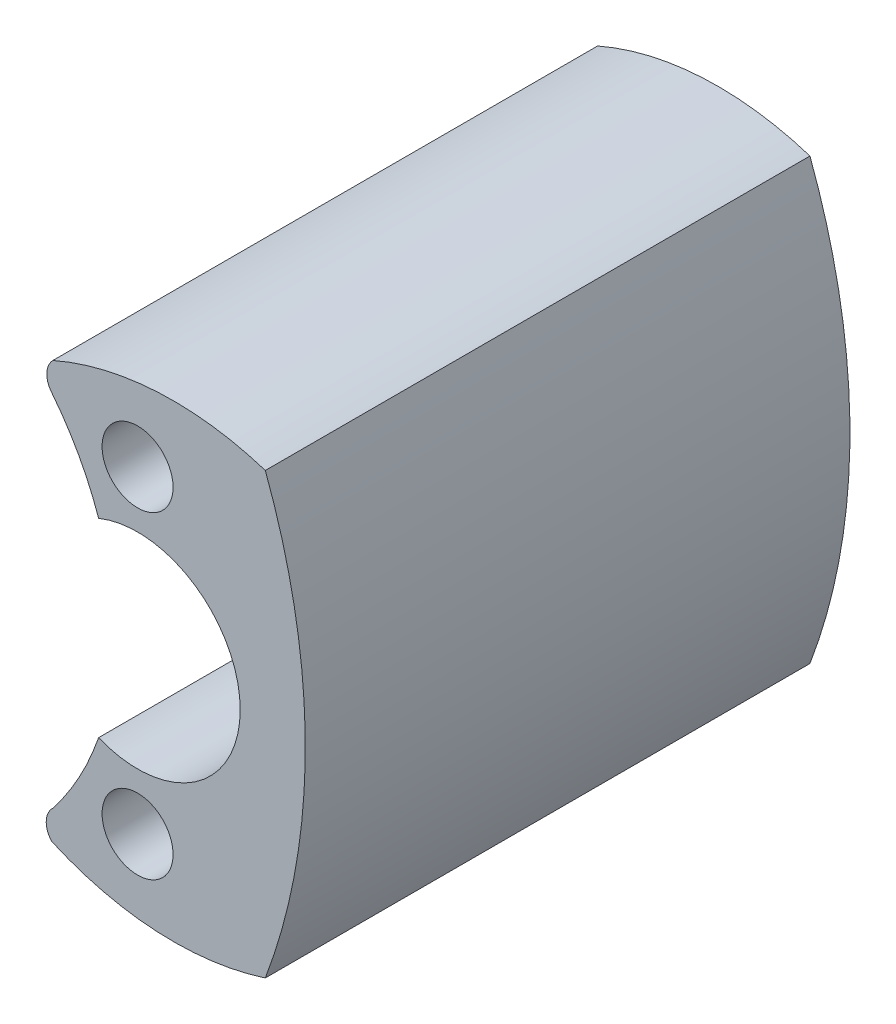
ISO-10303-21;
HEADER;
FILE_DESCRIPTION(('STEP AP214'),'2;1');
FILE_NAME('part.step','',(''),(''),'','','');
FILE_SCHEMA(('AUTOMOTIVE_DESIGN { 1 0 10303 214 1 1 1 1 }'));
ENDSEC;
DATA;
#1=APPLICATION_CONTEXT('core data for automotive mechanical design processes');
#2=APPLICATION_PROTOCOL_DEFINITION('international standard','automotive_design',2000,#1);
#3=PRODUCT_CONTEXT('',#1,'mechanical');
#4=PRODUCT('Part','Part','',(#3));
#5=PRODUCT_RELATED_PRODUCT_CATEGORY('part','',(#4));
#6=PRODUCT_DEFINITION_FORMATION('','',#4);
#7=PRODUCT_DEFINITION_CONTEXT('part definition',#1,'design');
#8=PRODUCT_DEFINITION('design','',#6,#7);
#9=PRODUCT_DEFINITION_SHAPE('','',#8);
#10=(LENGTH_UNIT() NAMED_UNIT(*) SI_UNIT(.MILLI.,.METRE.));
#11=(NAMED_UNIT(*) PLANE_ANGLE_UNIT() SI_UNIT($,.RADIAN.));
#12=(NAMED_UNIT(*) SI_UNIT($,.STERADIAN.) SOLID_ANGLE_UNIT());
#13=UNCERTAINTY_MEASURE_WITH_UNIT(LENGTH_MEASURE(1.E-05),#10,'distance_accuracy_value','');
#14=(GEOMETRIC_REPRESENTATION_CONTEXT(3) GLOBAL_UNCERTAINTY_ASSIGNED_CONTEXT((#13)) GLOBAL_UNIT_ASSIGNED_CONTEXT((#10,
#11,#12)) REPRESENTATION_CONTEXT('',''));
#15=CARTESIAN_POINT('',(0.,0.,0.));
#16=DIRECTION('',(0.,0.,1.));
#17=DIRECTION('',(1.,0.,0.));
#18=AXIS2_PLACEMENT_3D('',#15,#16,#17);
#19=CARTESIAN_POINT('',(-13.2313355478784,0.,23.));
#20=DIRECTION('',(0.,0.,-1.));
#21=DIRECTION('',(-1.,0.,0.));
#22=AXIS2_PLACEMENT_3D('',#19,#20,#21);
#23=CYLINDRICAL_SURFACE('',#22,12.2604861513936);
#24=CARTESIAN_POINT('',(-13.2313355478784,0.,23.));
#25=DIRECTION('',(0.,0.,-1.));
#26=DIRECTION('',(-1.,0.,0.));
#27=AXIS2_PLACEMENT_3D('',#24,#25,#26);
#28=CIRCLE('',#27,12.2604861513936);
#29=CARTESIAN_POINT('',(-1.64537225114125,-4.01060782864323,23.));
#30=VERTEX_POINT('',#29);
#31=CARTESIAN_POINT('',(-3.57576767996249,-7.55576136577806,23.));
#32=VERTEX_POINT('',#31);
#33=EDGE_CURVE('E123',#30,#32,#28,.T.);
#34=ORIENTED_EDGE('',*,*,#33,.F.);
#35=DIRECTION('',(0.,0.,-1.));
#36=VECTOR('',#35,1.);
#37=CARTESIAN_POINT('',(-1.64537225114125,-4.01060782864323,11.999));
#38=LINE('',#37,#36);
#39=CARTESIAN_POINT('',(-1.64537225114125,-4.01060782864323,-0.001));
#40=VERTEX_POINT('',#39);
#41=EDGE_CURVE('E110',#30,#40,#38,.T.);
#42=ORIENTED_EDGE('',*,*,#41,.T.);
#43=CARTESIAN_POINT('',(-13.2313355478784,0.,-0.001));
#44=DIRECTION('',(0.,0.,-1.));
#45=DIRECTION('',(-1.,0.,0.));
#46=AXIS2_PLACEMENT_3D('',#43,#44,#45);
#47=CIRCLE('',#46,12.2604861513936);
#48=CARTESIAN_POINT('',(-3.57576767996249,-7.55576136577806,-0.001));
#49=VERTEX_POINT('',#48);
#50=EDGE_CURVE('E121',#40,#49,#47,.T.);
#51=ORIENTED_EDGE('',*,*,#50,.T.);
#52=DIRECTION('',(0.,0.,-1.));
#53=VECTOR('',#52,1.);
#54=CARTESIAN_POINT('',(-3.57576767996249,-7.55576136577806,23.));
#55=LINE('',#54,#53);
#56=EDGE_CURVE('E165',#32,#49,#55,.T.);
#57=ORIENTED_EDGE('',*,*,#56,.F.);
#58=EDGE_LOOP('',(#34,#42,#51,#57));
#59=FACE_BOUND('',#58,.T.);
#60=ADVANCED_FACE('F45',(#59),#23,.F.);
#61=CARTESIAN_POINT('',(1.51645658150854,-2.74018411875687,23.));
#62=DIRECTION('',(0.,0.,-1.));
#63=DIRECTION('',(-1.,0.,0.));
#64=AXIS2_PLACEMENT_3D('',#61,#62,#63);
#65=CYLINDRICAL_SURFACE('',#64,12.6318125052895);
#66=DIRECTION('',(0.,0.,-1.));
#67=VECTOR('',#66,1.);
#68=CARTESIAN_POINT('',(5.39429470920508,9.28167341758802,23.));
#69=LINE('',#68,#67);
#70=CARTESIAN_POINT('',(5.39429470920508,9.28167341758802,23.));
#71=VERTEX_POINT('',#70);
#72=CARTESIAN_POINT('',(5.39429470920508,9.28167341758802,-0.001));
#73=VERTEX_POINT('',#72);
#74=EDGE_CURVE('E159',#71,#73,#69,.T.);
#75=ORIENTED_EDGE('',*,*,#74,.T.);
#76=CARTESIAN_POINT('',(1.51645658150854,-2.74018411875687,-0.001));
#77=DIRECTION('',(0.,0.,1.));
#78=DIRECTION('',(-1.,0.,0.));
#79=AXIS2_PLACEMENT_3D('',#76,#77,#78);
#80=CIRCLE('',#79,12.6318125052895);
#81=CARTESIAN_POINT('',(-3.57576767996249,8.81974404882597,-0.001));
#82=VERTEX_POINT('',#81);
#83=EDGE_CURVE('E136',#73,#82,#80,.T.);
#84=ORIENTED_EDGE('',*,*,#83,.T.);
#85=DIRECTION('',(0.,0.,-1.));
#86=VECTOR('',#85,1.);
#87=CARTESIAN_POINT('',(-3.57576767996249,8.81974404882597,23.));
#88=LINE('',#87,#86);
#89=CARTESIAN_POINT('',(-3.57576767996249,8.81974404882597,23.));
#90=VERTEX_POINT('',#89);
#91=EDGE_CURVE('E11',#90,#82,#88,.T.);
#92=ORIENTED_EDGE('',*,*,#91,.F.);
#93=CARTESIAN_POINT('',(1.51645658150854,-2.74018411875687,23.));
#94=DIRECTION('',(0.,0.,1.));
#95=DIRECTION('',(-1.,0.,0.));
#96=AXIS2_PLACEMENT_3D('',#93,#94,#95);
#97=CIRCLE('',#96,12.6318125052895);
#98=EDGE_CURVE('E147',#71,#90,#97,.T.);
#99=ORIENTED_EDGE('',*,*,#98,.F.);
#100=EDGE_LOOP('',(#75,#84,#92,#99));
#101=FACE_BOUND('',#100,.T.);
#102=ADVANCED_FACE('F47',(#101),#65,.T.);
#103=CARTESIAN_POINT('',(-2.93942531431104,8.19213389498871,23.));
#104=DIRECTION('',(0.,0.,-1.));
#105=DIRECTION('',(-1.,0.,0.));
#106=AXIS2_PLACEMENT_3D('',#103,#104,#105);
#107=CYLINDRICAL_SURFACE('',#106,0.893770726485547);
#108=ORIENTED_EDGE('',*,*,#91,.T.);
#109=CARTESIAN_POINT('',(-2.93942531431104,8.19213389498871,-0.001));
#110=DIRECTION('',(0.,0.,1.));
#111=DIRECTION('',(-1.,0.,0.));
#112=AXIS2_PLACEMENT_3D('',#109,#110,#111);
#113=CIRCLE('',#112,0.893770726485547);
#114=CARTESIAN_POINT('',(-3.63871286599695,7.63551640372596,-0.001));
#115=VERTEX_POINT('',#114);
#116=EDGE_CURVE('E133',#82,#115,#113,.T.);
#117=ORIENTED_EDGE('',*,*,#116,.T.);
#118=DIRECTION('',(0.,0.,-1.));
#119=VECTOR('',#118,1.);
#120=CARTESIAN_POINT('',(-3.63871286599695,7.63551640372596,23.));
#121=LINE('',#120,#119);
#122=CARTESIAN_POINT('',(-3.63871286599695,7.63551640372596,23.));
#123=VERTEX_POINT('',#122);
#124=EDGE_CURVE('E53',#123,#115,#121,.T.);
#125=ORIENTED_EDGE('',*,*,#124,.F.);
#126=CARTESIAN_POINT('',(-2.93942531431104,8.19213389498871,23.));
#127=DIRECTION('',(0.,0.,1.));
#128=DIRECTION('',(-1.,0.,0.));
#129=AXIS2_PLACEMENT_3D('',#126,#127,#128);
#130=CIRCLE('',#129,0.893770726485547);
#131=EDGE_CURVE('E149',#90,#123,#130,.T.);
#132=ORIENTED_EDGE('',*,*,#131,.F.);
#133=EDGE_LOOP('',(#108,#117,#125,#132));
#134=FACE_BOUND('',#133,.T.);
#135=ADVANCED_FACE('F174',(#134),#107,.T.);
#136=CARTESIAN_POINT('',(-1.64537225114125,4.01060782864323,-0.00100000000000088));
#137=VERTEX_POINT('',#136);
#138=EDGE_CURVE('E132',#115,#137,#47,.T.);
#139=ORIENTED_EDGE('',*,*,#138,.T.);
#140=DIRECTION('',(0.,0.,-1.));
#141=VECTOR('',#140,1.);
#142=CARTESIAN_POINT('',(-1.64537225114125,4.01060782864323,11.999));
#143=LINE('',#142,#141);
#144=CARTESIAN_POINT('',(-1.64537225114125,4.01060782864323,23.));
#145=VERTEX_POINT('',#144);
#146=EDGE_CURVE('E60',#137,#145,#143,.F.);
#147=ORIENTED_EDGE('',*,*,#146,.T.);
#148=EDGE_CURVE('E151',#123,#145,#28,.T.);
#149=ORIENTED_EDGE('',*,*,#148,.F.);
#150=ORIENTED_EDGE('',*,*,#124,.T.);
#151=EDGE_LOOP('',(#139,#147,#149,#150));
#152=FACE_BOUND('',#151,.T.);
#153=ADVANCED_FACE('F169',(#152),#23,.F.);
#154=CARTESIAN_POINT('',(-2.97974763085371,-8.20163469798779,23.));
#155=DIRECTION('',(0.,0.,-1.));
#156=DIRECTION('',(-1.,0.,0.));
#157=AXIS2_PLACEMENT_3D('',#154,#155,#156);
#158=CYLINDRICAL_SURFACE('',#157,0.878858498393984);
#159=ORIENTED_EDGE('',*,*,#56,.T.);
#160=CARTESIAN_POINT('',(-2.97974763085371,-8.20163469798779,-0.001));
#161=DIRECTION('',(0.,0.,1.));
#162=DIRECTION('',(1.,0.,0.));
#163=AXIS2_PLACEMENT_3D('',#160,#161,#162);
#164=CIRCLE('',#163,0.878858498393984);
#165=CARTESIAN_POINT('',(-3.62562096306344,-8.79765474709655,-0.001));
#166=VERTEX_POINT('',#165);
#167=EDGE_CURVE('E131',#49,#166,#164,.T.);
#168=ORIENTED_EDGE('',*,*,#167,.T.);
#169=DIRECTION('',(0.,0.,-1.));
#170=VECTOR('',#169,1.);
#171=CARTESIAN_POINT('',(-3.62562096306344,-8.79765474709655,23.));
#172=LINE('',#171,#170);
#173=CARTESIAN_POINT('',(-3.62562096306344,-8.79765474709655,23.));
#174=VERTEX_POINT('',#173);
#175=EDGE_CURVE('E163',#174,#166,#172,.T.);
#176=ORIENTED_EDGE('',*,*,#175,.F.);
#177=CARTESIAN_POINT('',(-2.97974763085371,-8.20163469798779,23.));
#178=DIRECTION('',(0.,0.,1.));
#179=DIRECTION('',(1.,0.,0.));
#180=AXIS2_PLACEMENT_3D('',#177,#178,#179);
#181=CIRCLE('',#180,0.878858498393984);
#182=EDGE_CURVE('E154',#32,#174,#181,.T.);
#183=ORIENTED_EDGE('',*,*,#182,.F.);
#184=EDGE_LOOP('',(#159,#168,#176,#183));
#185=FACE_BOUND('',#184,.T.);
#186=ADVANCED_FACE('F196',(#185),#158,.T.);
#187=CARTESIAN_POINT('',(1.51645658150854,2.74018411875671,23.));
#188=DIRECTION('',(0.,0.,-1.));
#189=DIRECTION('',(-1.,0.,0.));
#190=AXIS2_PLACEMENT_3D('',#187,#188,#189);
#191=CYLINDRICAL_SURFACE('',#190,12.6318125052894);
#192=ORIENTED_EDGE('',*,*,#175,.T.);
#193=CARTESIAN_POINT('',(1.51645658150854,2.74018411875671,-0.001));
#194=DIRECTION('',(0.,0.,1.));
#195=DIRECTION('',(1.,0.,0.));
#196=AXIS2_PLACEMENT_3D('',#193,#194,#195);
#197=CIRCLE('',#196,12.6318125052894);
#198=CARTESIAN_POINT('',(5.39429470920509,-9.28167341758802,-0.001));
#199=VERTEX_POINT('',#198);
#200=EDGE_CURVE('E141',#166,#199,#197,.T.);
#201=ORIENTED_EDGE('',*,*,#200,.T.);
#202=DIRECTION('',(0.,0.,-1.));
#203=VECTOR('',#202,1.);
#204=CARTESIAN_POINT('',(5.39429470920509,-9.28167341758802,23.));
#205=LINE('',#204,#203);
#206=CARTESIAN_POINT('',(5.39429470920509,-9.28167341758802,23.));
#207=VERTEX_POINT('',#206);
#208=EDGE_CURVE('E161',#207,#199,#205,.T.);
#209=ORIENTED_EDGE('',*,*,#208,.F.);
#210=CARTESIAN_POINT('',(1.51645658150854,2.74018411875671,23.));
#211=DIRECTION('',(0.,0.,1.));
#212=DIRECTION('',(1.,0.,0.));
#213=AXIS2_PLACEMENT_3D('',#210,#211,#212);
#214=CIRCLE('',#213,12.6318125052894);
#215=EDGE_CURVE('E156',#174,#207,#214,.T.);
#216=ORIENTED_EDGE('',*,*,#215,.F.);
#217=EDGE_LOOP('',(#192,#201,#209,#216));
#218=FACE_BOUND('',#217,.T.);
#219=ADVANCED_FACE('F200',(#218),#191,.T.);
#220=CARTESIAN_POINT('',(-19.2656664170293,0.,23.));
#221=DIRECTION('',(0.,0.,-1.));
#222=DIRECTION('',(-1.,0.,0.));
#223=AXIS2_PLACEMENT_3D('',#220,#221,#222);
#224=CYLINDRICAL_SURFACE('',#223,26.3488736794981);
#225=ORIENTED_EDGE('',*,*,#208,.T.);
#226=CARTESIAN_POINT('',(-19.2656664170293,0.,-0.001));
#227=DIRECTION('',(0.,0.,1.));
#228=DIRECTION('',(-1.,0.,0.));
#229=AXIS2_PLACEMENT_3D('',#226,#227,#228);
#230=CIRCLE('',#229,26.3488736794981);
#231=EDGE_CURVE('E144',#199,#73,#230,.T.);
#232=ORIENTED_EDGE('',*,*,#231,.T.);
#233=ORIENTED_EDGE('',*,*,#74,.F.);
#234=CARTESIAN_POINT('',(-19.2656664170293,0.,23.));
#235=DIRECTION('',(0.,0.,1.));
#236=DIRECTION('',(-1.,0.,0.));
#237=AXIS2_PLACEMENT_3D('',#234,#235,#236);
#238=CIRCLE('',#237,26.3488736794981);
#239=EDGE_CURVE('E68',#207,#71,#238,.T.);
#240=ORIENTED_EDGE('',*,*,#239,.F.);
#241=EDGE_LOOP('',(#225,#232,#233,#240));
#242=FACE_BOUND('',#241,.T.);
#243=ADVANCED_FACE('F202',(#242),#224,.T.);
#244=CARTESIAN_POINT('',(-8.87460491776037,-1.37009205937844,23.));
#245=DIRECTION('',(0.,0.,-1.));
#246=DIRECTION('',(-1.,0.,0.));
#247=AXIS2_PLACEMENT_3D('',#244,#245,#246);
#248=PLANE('',#247);
#249=CARTESIAN_POINT('',(0.,-6.715,23.));
#250=DIRECTION('',(0.,0.,1.));
#251=DIRECTION('',(-1.,0.,0.));
#252=AXIS2_PLACEMENT_3D('',#249,#250,#251);
#253=CIRCLE('',#252,1.5);
#254=CARTESIAN_POINT('',(-1.5,-6.715,23.));
#255=VERTEX_POINT('',#254);
#256=EDGE_CURVE('E124',#255,#255,#253,.T.);
#257=ORIENTED_EDGE('',*,*,#256,.F.);
#258=EDGE_LOOP('',(#257));
#259=FACE_BOUND('',#258,.T.);
#260=CARTESIAN_POINT('',(0.,6.715,23.));
#261=DIRECTION('',(0.,0.,1.));
#262=DIRECTION('',(1.,0.,0.));
#263=AXIS2_PLACEMENT_3D('',#260,#261,#262);
#264=CIRCLE('',#263,1.5);
#265=CARTESIAN_POINT('',(1.5,6.715,23.));
#266=VERTEX_POINT('',#265);
#267=EDGE_CURVE('E181',#266,#266,#264,.T.);
#268=ORIENTED_EDGE('',*,*,#267,.F.);
#269=EDGE_LOOP('',(#268));
#270=FACE_BOUND('',#269,.T.);
#271=ORIENTED_EDGE('',*,*,#148,.T.);
#272=CARTESIAN_POINT('',(0.,0.,23.));
#273=DIRECTION('',(0.,0.,-1.));
#274=DIRECTION('',(-1.,0.,0.));
#275=AXIS2_PLACEMENT_3D('',#272,#273,#274);
#276=CIRCLE('',#275,4.335);
#277=EDGE_CURVE('E116',#145,#30,#276,.T.);
#278=ORIENTED_EDGE('',*,*,#277,.T.);
#279=ORIENTED_EDGE('',*,*,#33,.T.);
#280=ORIENTED_EDGE('',*,*,#182,.T.);
#281=ORIENTED_EDGE('',*,*,#215,.T.);
#282=ORIENTED_EDGE('',*,*,#239,.T.);
#283=ORIENTED_EDGE('',*,*,#98,.T.);
#284=ORIENTED_EDGE('',*,*,#131,.T.);
#285=EDGE_LOOP('',(#271,#278,#279,#280,#281,#282,#283,#284));
#286=FACE_BOUND('',#285,.T.);
#287=ADVANCED_FACE('F192',(#259,#270,#286),#248,.F.);
#288=CARTESIAN_POINT('',(-8.87460491776037,-1.37009205937844,-0.001));
#289=DIRECTION('',(0.,0.,-1.));
#290=DIRECTION('',(-1.,0.,0.));
#291=AXIS2_PLACEMENT_3D('',#288,#289,#290);
#292=PLANE('',#291);
#293=CARTESIAN_POINT('',(0.,0.,-0.001));
#294=DIRECTION('',(0.,0.,-1.));
#295=DIRECTION('',(-1.,0.,0.));
#296=AXIS2_PLACEMENT_3D('',#293,#294,#295);
#297=CIRCLE('',#296,4.335);
#298=EDGE_CURVE('E107',#137,#40,#297,.T.);
#299=ORIENTED_EDGE('',*,*,#298,.F.);
#300=ORIENTED_EDGE('',*,*,#138,.F.);
#301=ORIENTED_EDGE('',*,*,#116,.F.);
#302=ORIENTED_EDGE('',*,*,#83,.F.);
#303=ORIENTED_EDGE('',*,*,#231,.F.);
#304=ORIENTED_EDGE('',*,*,#200,.F.);
#305=ORIENTED_EDGE('',*,*,#167,.F.);
#306=ORIENTED_EDGE('',*,*,#50,.F.);
#307=EDGE_LOOP('',(#299,#300,#301,#302,#303,#304,#305,#306));
#308=FACE_BOUND('',#307,.T.);
#309=CARTESIAN_POINT('',(0.,-6.715,-0.001000000000001));
#310=DIRECTION('',(0.,0.,1.));
#311=DIRECTION('',(-1.,0.,0.));
#312=AXIS2_PLACEMENT_3D('',#309,#310,#311);
#313=CIRCLE('',#312,1.5);
#314=CARTESIAN_POINT('',(-1.5,-6.715,-0.001000000000001));
#315=VERTEX_POINT('',#314);
#316=EDGE_CURVE('E185',#315,#315,#313,.T.);
#317=ORIENTED_EDGE('',*,*,#316,.T.);
#318=EDGE_LOOP('',(#317));
#319=FACE_BOUND('',#318,.T.);
#320=CARTESIAN_POINT('',(0.,6.715,-0.001000000000001));
#321=DIRECTION('',(0.,0.,1.));
#322=DIRECTION('',(1.,0.,0.));
#323=AXIS2_PLACEMENT_3D('',#320,#321,#322);
#324=CIRCLE('',#323,1.5);
#325=CARTESIAN_POINT('',(1.5,6.715,-0.001000000000001));
#326=VERTEX_POINT('',#325);
#327=EDGE_CURVE('E179',#326,#326,#324,.T.);
#328=ORIENTED_EDGE('',*,*,#327,.T.);
#329=EDGE_LOOP('',(#328));
#330=FACE_BOUND('',#329,.T.);
#331=ADVANCED_FACE('F127',(#308,#319,#330),#292,.T.);
#332=CARTESIAN_POINT('',(0.,6.715,-0.001000000000001));
#333=DIRECTION('',(0.,0.,1.));
#334=DIRECTION('',(1.,0.,0.));
#335=AXIS2_PLACEMENT_3D('',#332,#333,#334);
#336=CYLINDRICAL_SURFACE('',#335,1.5);
#337=ORIENTED_EDGE('',*,*,#327,.F.);
#338=EDGE_LOOP('',(#337));
#339=FACE_BOUND('',#338,.T.);
#340=ORIENTED_EDGE('',*,*,#267,.T.);
#341=EDGE_LOOP('',(#340));
#342=FACE_BOUND('',#341,.T.);
#343=ADVANCED_FACE('F273',(#339,#342),#336,.F.);
#344=CARTESIAN_POINT('',(0.,-6.715,-0.001000000000001));
#345=DIRECTION('',(0.,0.,1.));
#346=DIRECTION('',(1.,0.,0.));
#347=AXIS2_PLACEMENT_3D('',#344,#345,#346);
#348=CYLINDRICAL_SURFACE('',#347,1.5);
#349=ORIENTED_EDGE('',*,*,#316,.F.);
#350=EDGE_LOOP('',(#349));
#351=FACE_BOUND('',#350,.T.);
#352=ORIENTED_EDGE('',*,*,#256,.T.);
#353=EDGE_LOOP('',(#352));
#354=FACE_BOUND('',#353,.T.);
#355=ADVANCED_FACE('F243',(#351,#354),#348,.F.);
#356=CARTESIAN_POINT('',(0.,0.,23.999));
#357=DIRECTION('',(0.,0.,-1.));
#358=DIRECTION('',(-1.,0.,0.));
#359=AXIS2_PLACEMENT_3D('',#356,#357,#358);
#360=CYLINDRICAL_SURFACE('',#359,4.335);
#361=ORIENTED_EDGE('',*,*,#277,.F.);
#362=ORIENTED_EDGE('',*,*,#146,.F.);
#363=ORIENTED_EDGE('',*,*,#298,.T.);
#364=ORIENTED_EDGE('',*,*,#41,.F.);
#365=EDGE_LOOP('',(#361,#362,#363,#364));
#366=FACE_BOUND('',#365,.T.);
#367=ADVANCED_FACE('F109',(#366),#360,.F.);
#368=CLOSED_SHELL('',(#60,#102,#135,#153,#186,#219,#243,#287,#331,#343,#355,#367));
#369=MANIFOLD_SOLID_BREP('B2',#368);
#370=ADVANCED_BREP_SHAPE_REPRESENTATION('',(#18,#369),#14);
#371=SHAPE_DEFINITION_REPRESENTATION(#9,#370);
ENDSEC;
END-ISO-10303-21;
